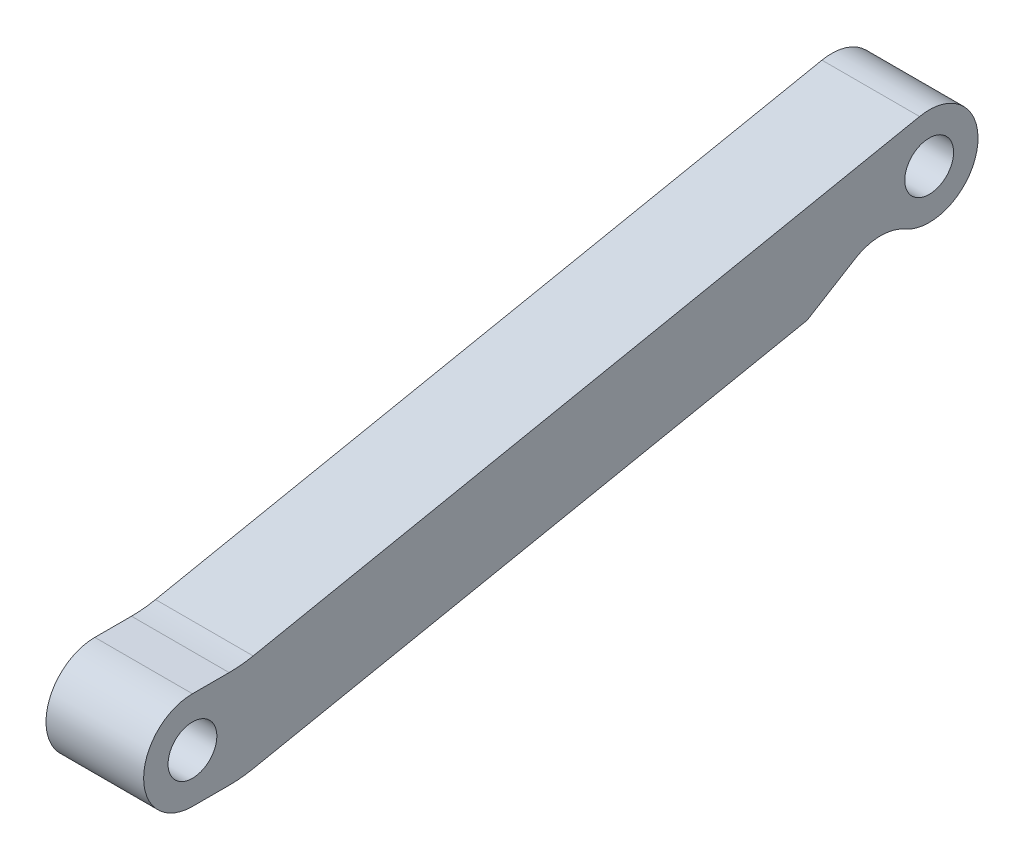
ISO-10303-21;
HEADER;
FILE_DESCRIPTION(('STEP AP214'),'2;1');
FILE_NAME('part.step','',(''),(''),'','','');
FILE_SCHEMA(('AUTOMOTIVE_DESIGN { 1 0 10303 214 1 1 1 1 }'));
ENDSEC;
DATA;
#1=APPLICATION_CONTEXT('core data for automotive mechanical design processes');
#2=APPLICATION_PROTOCOL_DEFINITION('international standard','automotive_design',2000,#1);
#3=PRODUCT_CONTEXT('',#1,'mechanical');
#4=PRODUCT('Part','Part','',(#3));
#5=PRODUCT_RELATED_PRODUCT_CATEGORY('part','',(#4));
#6=PRODUCT_DEFINITION_FORMATION('','',#4);
#7=PRODUCT_DEFINITION_CONTEXT('part definition',#1,'design');
#8=PRODUCT_DEFINITION('design','',#6,#7);
#9=PRODUCT_DEFINITION_SHAPE('','',#8);
#10=(LENGTH_UNIT() NAMED_UNIT(*) SI_UNIT(.MILLI.,.METRE.));
#11=(NAMED_UNIT(*) PLANE_ANGLE_UNIT() SI_UNIT($,.RADIAN.));
#12=(NAMED_UNIT(*) SI_UNIT($,.STERADIAN.) SOLID_ANGLE_UNIT());
#13=UNCERTAINTY_MEASURE_WITH_UNIT(LENGTH_MEASURE(1.E-05),#10,'distance_accuracy_value','');
#14=(GEOMETRIC_REPRESENTATION_CONTEXT(3) GLOBAL_UNCERTAINTY_ASSIGNED_CONTEXT((#13)) GLOBAL_UNIT_ASSIGNED_CONTEXT((#10,
#11,#12)) REPRESENTATION_CONTEXT('',''));
#15=CARTESIAN_POINT('',(0.,0.,0.));
#16=DIRECTION('',(0.,0.,1.));
#17=DIRECTION('',(1.,0.,0.));
#18=AXIS2_PLACEMENT_3D('',#15,#16,#17);
#19=CARTESIAN_POINT('',(-2.,-1.84612261210599,-75.7561745477478));
#20=DIRECTION('',(1.,0.,0.));
#21=DIRECTION('',(0.,0.,-1.));
#22=AXIS2_PLACEMENT_3D('',#19,#20,#21);
#23=CYLINDRICAL_SURFACE('',#22,2.00000000000001);
#24=DIRECTION('',(1.,0.,0.));
#25=VECTOR('',#24,1.);
#26=CARTESIAN_POINT('',(-2.,-0.110561306053009,-76.7500693877242));
#27=LINE('',#26,#25);
#28=CARTESIAN_POINT('',(-2.,-0.110561306053009,-76.7500693877242));
#29=VERTEX_POINT('',#28);
#30=CARTESIAN_POINT('',(2.,-0.110561306053009,-76.7500693877242));
#31=VERTEX_POINT('',#30);
#32=EDGE_CURVE('E43',#29,#31,#27,.T.);
#33=ORIENTED_EDGE('',*,*,#32,.T.);
#34=CARTESIAN_POINT('',(2.,-1.84612261210599,-75.7561745477478));
#35=DIRECTION('',(1.,0.,0.));
#36=DIRECTION('',(0.,0.,-1.));
#37=AXIS2_PLACEMENT_3D('',#34,#35,#36);
#38=CIRCLE('',#37,2.00000000000001);
#39=CARTESIAN_POINT('',(2.,-0.138375410523521,-74.7152136957042));
#40=VERTEX_POINT('',#39);
#41=EDGE_CURVE('E120',#31,#40,#38,.T.);
#42=ORIENTED_EDGE('',*,*,#41,.T.);
#43=DIRECTION('',(1.,0.,0.));
#44=VECTOR('',#43,1.);
#45=CARTESIAN_POINT('',(-2.,-0.138375410523521,-74.7152136957042));
#46=LINE('',#45,#44);
#47=CARTESIAN_POINT('',(-2.,-0.138375410523521,-74.7152136957042));
#48=VERTEX_POINT('',#47);
#49=EDGE_CURVE('E11',#48,#40,#46,.T.);
#50=ORIENTED_EDGE('',*,*,#49,.F.);
#51=CARTESIAN_POINT('',(-2.,-1.84612261210599,-75.7561745477478));
#52=DIRECTION('',(1.,0.,0.));
#53=DIRECTION('',(0.,0.,-1.));
#54=AXIS2_PLACEMENT_3D('',#51,#52,#53);
#55=CIRCLE('',#54,2.00000000000001);
#56=EDGE_CURVE('E56',#29,#48,#55,.T.);
#57=ORIENTED_EDGE('',*,*,#56,.F.);
#58=EDGE_LOOP('',(#33,#42,#50,#57));
#59=FACE_BOUND('',#58,.T.);
#60=ADVANCED_FACE('F39',(#59),#23,.F.);
#61=CARTESIAN_POINT('',(-2.,-33.3061606827947,-20.3018393884855));
#62=DIRECTION('',(0.,-0.853873600791226,-0.520480426021791));
#63=DIRECTION('',(0.,0.520480426021791,-0.853873600791226));
#64=AXIS2_PLACEMENT_3D('',#61,#62,#63);
#65=PLANE('',#64);
#66=ORIENTED_EDGE('',*,*,#49,.T.);
#67=DIRECTION('',(0.,0.520480426021791,-0.853873600791226));
#68=VECTOR('',#67,1.);
#69=CARTESIAN_POINT('',(2.,-33.3061606827947,-20.3018393884855));
#70=LINE('',#69,#68);
#71=CARTESIAN_POINT('',(2.,-1.33995461610038,-72.7439642277005));
#72=VERTEX_POINT('',#71);
#73=EDGE_CURVE('E137',#72,#40,#70,.T.);
#74=ORIENTED_EDGE('',*,*,#73,.F.);
#75=DIRECTION('',(1.,0.,0.));
#76=VECTOR('',#75,1.);
#77=CARTESIAN_POINT('',(-2.,-1.33995461610038,-72.7439642277005));
#78=LINE('',#77,#76);
#79=CARTESIAN_POINT('',(-2.,-1.33995461610038,-72.7439642277005));
#80=VERTEX_POINT('',#79);
#81=EDGE_CURVE('E48',#80,#72,#78,.T.);
#82=ORIENTED_EDGE('',*,*,#81,.F.);
#83=DIRECTION('',(0.,0.520480426021791,-0.853873600791226));
#84=VECTOR('',#83,1.);
#85=CARTESIAN_POINT('',(-2.,-33.3061606827947,-20.3018393884855));
#86=LINE('',#85,#84);
#87=EDGE_CURVE('E124',#80,#48,#86,.T.);
#88=ORIENTED_EDGE('',*,*,#87,.T.);
#89=EDGE_LOOP('',(#66,#74,#82,#88));
#90=FACE_BOUND('',#89,.T.);
#91=ADVANCED_FACE('F232',(#90),#65,.T.);
#92=CARTESIAN_POINT('',(-2.,-15.341055597126,-3.08340427821188));
#93=DIRECTION('',(0.,-0.980393511653588,-0.197049644271556));
#94=DIRECTION('',(0.,0.197049644271556,-0.980393511653588));
#95=AXIS2_PLACEMENT_3D('',#92,#93,#94);
#96=PLANE('',#95);
#97=ORIENTED_EDGE('',*,*,#81,.T.);
#98=DIRECTION('',(0.,0.197049644271556,-0.980393511653588));
#99=VECTOR('',#98,1.);
#100=CARTESIAN_POINT('',(2.,-15.341055597126,-3.08340427821188));
#101=LINE('',#100,#99);
#102=CARTESIAN_POINT('',(2.,-5.90196755826795,-50.0462937745782));
#103=VERTEX_POINT('',#102);
#104=EDGE_CURVE('E161',#103,#72,#101,.T.);
#105=ORIENTED_EDGE('',*,*,#104,.F.);
#106=DIRECTION('',(1.,0.,0.));
#107=VECTOR('',#106,1.);
#108=CARTESIAN_POINT('',(-2.,-5.90196755826795,-50.0462937745782));
#109=LINE('',#108,#107);
#110=CARTESIAN_POINT('',(-2.,-5.90196755826795,-50.0462937745782));
#111=VERTEX_POINT('',#110);
#112=EDGE_CURVE('E192',#111,#103,#109,.T.);
#113=ORIENTED_EDGE('',*,*,#112,.F.);
#114=DIRECTION('',(0.,0.197049644271556,-0.980393511653588));
#115=VECTOR('',#114,1.);
#116=CARTESIAN_POINT('',(-2.,-15.341055597126,-3.08340427821188));
#117=LINE('',#116,#115);
#118=EDGE_CURVE('E188',#111,#80,#117,.T.);
#119=ORIENTED_EDGE('',*,*,#118,.T.);
#120=EDGE_LOOP('',(#97,#105,#113,#119));
#121=FACE_BOUND('',#120,.T.);
#122=ADVANCED_FACE('F230',(#121),#96,.T.);
#123=CARTESIAN_POINT('',(-2.,-1.00000000000001,-49.0610455532204));
#124=DIRECTION('',(1.,0.,0.));
#125=DIRECTION('',(0.,0.,-1.));
#126=AXIS2_PLACEMENT_3D('',#123,#124,#125);
#127=CYLINDRICAL_SURFACE('',#126,5.);
#128=ORIENTED_EDGE('',*,*,#112,.T.);
#129=CARTESIAN_POINT('',(2.,-1.00000000000001,-49.0610455532204));
#130=DIRECTION('',(1.,0.,0.));
#131=DIRECTION('',(0.,0.,-1.));
#132=AXIS2_PLACEMENT_3D('',#129,#130,#131);
#133=CIRCLE('',#132,5.);
#134=CARTESIAN_POINT('',(2.,-6.00000000000001,-49.0610455532204));
#135=VERTEX_POINT('',#134);
#136=EDGE_CURVE('E158',#135,#103,#133,.T.);
#137=ORIENTED_EDGE('',*,*,#136,.F.);
#138=DIRECTION('',(1.,0.,0.));
#139=VECTOR('',#138,1.);
#140=CARTESIAN_POINT('',(-2.,-6.00000000000001,-49.0610455532204));
#141=LINE('',#140,#139);
#142=CARTESIAN_POINT('',(-2.,-6.00000000000001,-49.0610455532204));
#143=VERTEX_POINT('',#142);
#144=EDGE_CURVE('E194',#143,#135,#141,.T.);
#145=ORIENTED_EDGE('',*,*,#144,.F.);
#146=CARTESIAN_POINT('',(-2.,-1.00000000000001,-49.0610455532204));
#147=DIRECTION('',(1.,0.,0.));
#148=DIRECTION('',(0.,0.,-1.));
#149=AXIS2_PLACEMENT_3D('',#146,#147,#148);
#150=CIRCLE('',#149,5.);
#151=EDGE_CURVE('E185',#143,#111,#150,.T.);
#152=ORIENTED_EDGE('',*,*,#151,.T.);
#153=EDGE_LOOP('',(#128,#137,#145,#152));
#154=FACE_BOUND('',#153,.T.);
#155=ADVANCED_FACE('F227',(#154),#127,.T.);
#156=CARTESIAN_POINT('',(-2.,-6.00000000000006,0.));
#157=DIRECTION('',(0.,-1.,0.));
#158=DIRECTION('',(0.,0.,-1.));
#159=AXIS2_PLACEMENT_3D('',#156,#157,#158);
#160=PLANE('',#159);
#161=ORIENTED_EDGE('',*,*,#144,.T.);
#162=DIRECTION('',(0.,0.,-1.));
#163=VECTOR('',#162,1.);
#164=CARTESIAN_POINT('',(2.,-6.00000000000006,0.));
#165=LINE('',#164,#163);
#166=CARTESIAN_POINT('',(2.,-6.00000000000001,-47.55854679));
#167=VERTEX_POINT('',#166);
#168=EDGE_CURVE('E155',#167,#135,#165,.T.);
#169=ORIENTED_EDGE('',*,*,#168,.F.);
#170=DIRECTION('',(1.,0.,0.));
#171=VECTOR('',#170,1.);
#172=CARTESIAN_POINT('',(-2.,-6.00000000000001,-47.55854679));
#173=LINE('',#172,#171);
#174=CARTESIAN_POINT('',(-2.,-6.00000000000001,-47.55854679));
#175=VERTEX_POINT('',#174);
#176=EDGE_CURVE('E196',#175,#167,#173,.T.);
#177=ORIENTED_EDGE('',*,*,#176,.F.);
#178=DIRECTION('',(0.,0.,-1.));
#179=VECTOR('',#178,1.);
#180=CARTESIAN_POINT('',(-2.,-6.00000000000006,0.));
#181=LINE('',#180,#179);
#182=EDGE_CURVE('E182',#175,#143,#181,.T.);
#183=ORIENTED_EDGE('',*,*,#182,.T.);
#184=EDGE_LOOP('',(#161,#169,#177,#183));
#185=FACE_BOUND('',#184,.T.);
#186=ADVANCED_FACE('F223',(#185),#160,.T.);
#187=CARTESIAN_POINT('',(-2.,-4.00000000000001,-47.55854679));
#188=DIRECTION('',(1.,0.,0.));
#189=DIRECTION('',(0.,0.,-1.));
#190=AXIS2_PLACEMENT_3D('',#187,#188,#189);
#191=CYLINDRICAL_SURFACE('',#190,2.);
#192=ORIENTED_EDGE('',*,*,#176,.T.);
#193=CARTESIAN_POINT('',(2.,-4.00000000000001,-47.55854679));
#194=DIRECTION('',(1.,0.,0.));
#195=DIRECTION('',(0.,0.,-1.));
#196=AXIS2_PLACEMENT_3D('',#193,#194,#195);
#197=CIRCLE('',#196,2.);
#198=CARTESIAN_POINT('',(2.,-2.00000000000001,-47.55854679));
#199=VERTEX_POINT('',#198);
#200=EDGE_CURVE('E152',#199,#167,#197,.T.);
#201=ORIENTED_EDGE('',*,*,#200,.F.);
#202=DIRECTION('',(1.,0.,0.));
#203=VECTOR('',#202,1.);
#204=CARTESIAN_POINT('',(-2.,-2.00000000000001,-47.55854679));
#205=LINE('',#204,#203);
#206=CARTESIAN_POINT('',(-2.,-2.00000000000001,-47.55854679));
#207=VERTEX_POINT('',#206);
#208=EDGE_CURVE('E198',#207,#199,#205,.T.);
#209=ORIENTED_EDGE('',*,*,#208,.F.);
#210=CARTESIAN_POINT('',(-2.,-4.00000000000001,-47.55854679));
#211=DIRECTION('',(1.,0.,0.));
#212=DIRECTION('',(0.,0.,-1.));
#213=AXIS2_PLACEMENT_3D('',#210,#211,#212);
#214=CIRCLE('',#213,2.);
#215=EDGE_CURVE('E179',#207,#175,#214,.T.);
#216=ORIENTED_EDGE('',*,*,#215,.T.);
#217=EDGE_LOOP('',(#192,#201,#209,#216));
#218=FACE_BOUND('',#217,.T.);
#219=ADVANCED_FACE('F220',(#218),#191,.T.);
#220=CARTESIAN_POINT('',(-2.,-2.00000000000001,0.));
#221=DIRECTION('',(0.,-1.,0.));
#222=DIRECTION('',(0.,0.,-1.));
#223=AXIS2_PLACEMENT_3D('',#220,#221,#222);
#224=PLANE('',#223);
#225=ORIENTED_EDGE('',*,*,#208,.T.);
#226=DIRECTION('',(0.,0.,-1.));
#227=VECTOR('',#226,1.);
#228=CARTESIAN_POINT('',(2.,-2.00000000000001,0.));
#229=LINE('',#228,#227);
#230=CARTESIAN_POINT('',(2.,-2.00000000000001,-49.0610455532204));
#231=VERTEX_POINT('',#230);
#232=EDGE_CURVE('E149',#199,#231,#229,.T.);
#233=ORIENTED_EDGE('',*,*,#232,.T.);
#234=DIRECTION('',(1.,0.,0.));
#235=VECTOR('',#234,1.);
#236=CARTESIAN_POINT('',(-2.,-2.00000000000001,-49.0610455532204));
#237=LINE('',#236,#235);
#238=CARTESIAN_POINT('',(-2.,-2.00000000000001,-49.0610455532204));
#239=VERTEX_POINT('',#238);
#240=EDGE_CURVE('E200',#239,#231,#237,.T.);
#241=ORIENTED_EDGE('',*,*,#240,.F.);
#242=DIRECTION('',(0.,0.,-1.));
#243=VECTOR('',#242,1.);
#244=CARTESIAN_POINT('',(-2.,-2.00000000000001,0.));
#245=LINE('',#244,#243);
#246=EDGE_CURVE('E177',#207,#239,#245,.T.);
#247=ORIENTED_EDGE('',*,*,#246,.F.);
#248=EDGE_LOOP('',(#225,#233,#241,#247));
#249=FACE_BOUND('',#248,.T.);
#250=ADVANCED_FACE('F215',(#249),#224,.F.);
#251=CARTESIAN_POINT('',(-2.,2.99999999999999,-49.0610455532204));
#252=DIRECTION('',(1.,0.,0.));
#253=DIRECTION('',(0.,0.,-1.));
#254=AXIS2_PLACEMENT_3D('',#251,#252,#253);
#255=CYLINDRICAL_SURFACE('',#254,5.);
#256=ORIENTED_EDGE('',*,*,#240,.T.);
#257=CARTESIAN_POINT('',(2.,2.99999999999999,-49.0610455532204));
#258=DIRECTION('',(1.,0.,0.));
#259=DIRECTION('',(0.,0.,-1.));
#260=AXIS2_PLACEMENT_3D('',#257,#258,#259);
#261=CIRCLE('',#260,5.);
#262=CARTESIAN_POINT('',(2.,-1.90196755826794,-50.0462937745782));
#263=VERTEX_POINT('',#262);
#264=EDGE_CURVE('E146',#231,#263,#261,.T.);
#265=ORIENTED_EDGE('',*,*,#264,.T.);
#266=DIRECTION('',(1.,0.,0.));
#267=VECTOR('',#266,1.);
#268=CARTESIAN_POINT('',(-2.,-1.90196755826794,-50.0462937745782));
#269=LINE('',#268,#267);
#270=CARTESIAN_POINT('',(-2.,-1.90196755826794,-50.0462937745782));
#271=VERTEX_POINT('',#270);
#272=EDGE_CURVE('E202',#271,#263,#269,.T.);
#273=ORIENTED_EDGE('',*,*,#272,.F.);
#274=CARTESIAN_POINT('',(-2.,2.99999999999999,-49.0610455532204));
#275=DIRECTION('',(1.,0.,0.));
#276=DIRECTION('',(0.,0.,-1.));
#277=AXIS2_PLACEMENT_3D('',#274,#275,#276);
#278=CIRCLE('',#277,5.);
#279=EDGE_CURVE('E175',#239,#271,#278,.T.);
#280=ORIENTED_EDGE('',*,*,#279,.F.);
#281=EDGE_LOOP('',(#256,#265,#273,#280));
#282=FACE_BOUND('',#281,.T.);
#283=ADVANCED_FACE('F211',(#282),#255,.F.);
#284=CARTESIAN_POINT('',(-2.,-11.4963698463562,-2.31065950734196));
#285=DIRECTION('',(0.,-0.980393511653588,-0.197049644271556));
#286=DIRECTION('',(0.,0.197049644271556,-0.980393511653588));
#287=AXIS2_PLACEMENT_3D('',#284,#285,#286);
#288=PLANE('',#287);
#289=ORIENTED_EDGE('',*,*,#272,.T.);
#290=DIRECTION('',(0.,0.197049644271556,-0.980393511653588));
#291=VECTOR('',#290,1.);
#292=CARTESIAN_POINT('',(2.,-11.4963698463562,-2.31065950734196));
#293=LINE('',#292,#291);
#294=CARTESIAN_POINT('',(2.,3.58578702330714,-77.3498649391574));
#295=VERTEX_POINT('',#294);
#296=EDGE_CURVE('E132',#263,#295,#293,.T.);
#297=ORIENTED_EDGE('',*,*,#296,.T.);
#298=DIRECTION('',(1.,0.,0.));
#299=VECTOR('',#298,1.);
#300=CARTESIAN_POINT('',(-2.,3.58578702330714,-77.3498649391574));
#301=LINE('',#300,#299);
#302=CARTESIAN_POINT('',(-2.,3.58578702330714,-77.3498649391574));
#303=VERTEX_POINT('',#302);
#304=EDGE_CURVE('E123',#303,#295,#301,.T.);
#305=ORIENTED_EDGE('',*,*,#304,.F.);
#306=DIRECTION('',(0.,0.197049644271556,-0.980393511653588));
#307=VECTOR('',#306,1.);
#308=CARTESIAN_POINT('',(-2.,-11.4963698463562,-2.31065950734196));
#309=LINE('',#308,#307);
#310=EDGE_CURVE('E173',#271,#303,#309,.T.);
#311=ORIENTED_EDGE('',*,*,#310,.F.);
#312=EDGE_LOOP('',(#289,#297,#305,#311));
#313=FACE_BOUND('',#312,.T.);
#314=ADVANCED_FACE('F206',(#313),#288,.F.);
#315=CARTESIAN_POINT('',(-2.,1.62499999999996,-77.7439642277005));
#316=DIRECTION('',(1.,0.,0.));
#317=DIRECTION('',(0.,0.,-1.));
#318=AXIS2_PLACEMENT_3D('',#315,#316,#317);
#319=CYLINDRICAL_SURFACE('',#318,1.00000000000001);
#320=CARTESIAN_POINT('',(-2.,1.62499999999996,-77.7439642277005));
#321=DIRECTION('',(1.,0.,0.));
#322=DIRECTION('',(0.,0.,-1.));
#323=AXIS2_PLACEMENT_3D('',#320,#321,#322);
#324=CIRCLE('',#323,1.00000000000001);
#325=CARTESIAN_POINT('',(-2.,1.62499999999996,-78.7439642277006));
#326=VERTEX_POINT('',#325);
#327=EDGE_CURVE('E167',#326,#326,#324,.T.);
#328=ORIENTED_EDGE('',*,*,#327,.F.);
#329=EDGE_LOOP('',(#328));
#330=FACE_BOUND('',#329,.T.);
#331=CARTESIAN_POINT('',(2.,1.62499999999996,-77.7439642277005));
#332=DIRECTION('',(1.,0.,0.));
#333=DIRECTION('',(0.,0.,-1.));
#334=AXIS2_PLACEMENT_3D('',#331,#332,#333);
#335=CIRCLE('',#334,1.00000000000001);
#336=CARTESIAN_POINT('',(2.,1.62499999999996,-78.7439642277006));
#337=VERTEX_POINT('',#336);
#338=EDGE_CURVE('E138',#337,#337,#335,.T.);
#339=ORIENTED_EDGE('',*,*,#338,.T.);
#340=EDGE_LOOP('',(#339));
#341=FACE_BOUND('',#340,.T.);
#342=ADVANCED_FACE('F252',(#330,#341),#319,.F.);
#343=CARTESIAN_POINT('',(-2.,-4.00000000000001,-47.55854679));
#344=DIRECTION('',(1.,0.,0.));
#345=DIRECTION('',(0.,0.,-1.));
#346=AXIS2_PLACEMENT_3D('',#343,#344,#345);
#347=CYLINDRICAL_SURFACE('',#346,1.00000000000001);
#348=CARTESIAN_POINT('',(-2.,-4.00000000000001,-47.55854679));
#349=DIRECTION('',(1.,0.,0.));
#350=DIRECTION('',(0.,0.,-1.));
#351=AXIS2_PLACEMENT_3D('',#348,#349,#350);
#352=CIRCLE('',#351,1.00000000000001);
#353=CARTESIAN_POINT('',(-2.,-4.00000000000001,-48.55854679));
#354=VERTEX_POINT('',#353);
#355=EDGE_CURVE('E164',#354,#354,#352,.T.);
#356=ORIENTED_EDGE('',*,*,#355,.F.);
#357=EDGE_LOOP('',(#356));
#358=FACE_BOUND('',#357,.T.);
#359=CARTESIAN_POINT('',(2.,-4.00000000000001,-47.55854679));
#360=DIRECTION('',(1.,0.,0.));
#361=DIRECTION('',(0.,0.,-1.));
#362=AXIS2_PLACEMENT_3D('',#359,#360,#361);
#363=CIRCLE('',#362,1.00000000000001);
#364=CARTESIAN_POINT('',(2.,-4.00000000000001,-48.55854679));
#365=VERTEX_POINT('',#364);
#366=EDGE_CURVE('E141',#365,#365,#363,.T.);
#367=ORIENTED_EDGE('',*,*,#366,.T.);
#368=EDGE_LOOP('',(#367));
#369=FACE_BOUND('',#368,.T.);
#370=ADVANCED_FACE('F41',(#358,#369),#347,.F.);
#371=CARTESIAN_POINT('',(-2.,1.62499999999996,-77.7439642277005));
#372=DIRECTION('',(1.,0.,0.));
#373=DIRECTION('',(0.,0.,-1.));
#374=AXIS2_PLACEMENT_3D('',#371,#372,#373);
#375=CYLINDRICAL_SURFACE('',#374,2.);
#376=ORIENTED_EDGE('',*,*,#304,.T.);
#377=CARTESIAN_POINT('',(2.,1.62499999999996,-77.7439642277005));
#378=DIRECTION('',(1.,0.,0.));
#379=DIRECTION('',(0.,0.,-1.));
#380=AXIS2_PLACEMENT_3D('',#377,#378,#379);
#381=CIRCLE('',#380,2.);
#382=EDGE_CURVE('E126',#31,#295,#381,.T.);
#383=ORIENTED_EDGE('',*,*,#382,.F.);
#384=ORIENTED_EDGE('',*,*,#32,.F.);
#385=CARTESIAN_POINT('',(-2.,1.62499999999996,-77.7439642277005));
#386=DIRECTION('',(1.,0.,0.));
#387=DIRECTION('',(0.,0.,-1.));
#388=AXIS2_PLACEMENT_3D('',#385,#386,#387);
#389=CIRCLE('',#388,2.);
#390=EDGE_CURVE('E171',#29,#303,#389,.T.);
#391=ORIENTED_EDGE('',*,*,#390,.T.);
#392=EDGE_LOOP('',(#376,#383,#384,#391));
#393=FACE_BOUND('',#392,.T.);
#394=ADVANCED_FACE('F127',(#393),#375,.T.);
#395=CARTESIAN_POINT('',(-2.,0.,0.));
#396=DIRECTION('',(1.,0.,0.));
#397=DIRECTION('',(0.,0.,-1.));
#398=AXIS2_PLACEMENT_3D('',#395,#396,#397);
#399=PLANE('',#398);
#400=ORIENTED_EDGE('',*,*,#355,.T.);
#401=EDGE_LOOP('',(#400));
#402=FACE_BOUND('',#401,.T.);
#403=ORIENTED_EDGE('',*,*,#327,.T.);
#404=EDGE_LOOP('',(#403));
#405=FACE_BOUND('',#404,.T.);
#406=ORIENTED_EDGE('',*,*,#56,.T.);
#407=ORIENTED_EDGE('',*,*,#87,.F.);
#408=ORIENTED_EDGE('',*,*,#118,.F.);
#409=ORIENTED_EDGE('',*,*,#151,.F.);
#410=ORIENTED_EDGE('',*,*,#182,.F.);
#411=ORIENTED_EDGE('',*,*,#215,.F.);
#412=ORIENTED_EDGE('',*,*,#246,.T.);
#413=ORIENTED_EDGE('',*,*,#279,.T.);
#414=ORIENTED_EDGE('',*,*,#310,.T.);
#415=ORIENTED_EDGE('',*,*,#390,.F.);
#416=EDGE_LOOP('',(#406,#407,#408,#409,#410,#411,#412,#413,#414,#415));
#417=FACE_BOUND('',#416,.T.);
#418=ADVANCED_FACE('F233',(#402,#405,#417),#399,.F.);
#419=CARTESIAN_POINT('',(2.,0.,0.));
#420=DIRECTION('',(1.,0.,0.));
#421=DIRECTION('',(0.,0.,-1.));
#422=AXIS2_PLACEMENT_3D('',#419,#420,#421);
#423=PLANE('',#422);
#424=ORIENTED_EDGE('',*,*,#366,.F.);
#425=EDGE_LOOP('',(#424));
#426=FACE_BOUND('',#425,.T.);
#427=ORIENTED_EDGE('',*,*,#338,.F.);
#428=EDGE_LOOP('',(#427));
#429=FACE_BOUND('',#428,.T.);
#430=ORIENTED_EDGE('',*,*,#41,.F.);
#431=ORIENTED_EDGE('',*,*,#382,.T.);
#432=ORIENTED_EDGE('',*,*,#296,.F.);
#433=ORIENTED_EDGE('',*,*,#264,.F.);
#434=ORIENTED_EDGE('',*,*,#232,.F.);
#435=ORIENTED_EDGE('',*,*,#200,.T.);
#436=ORIENTED_EDGE('',*,*,#168,.T.);
#437=ORIENTED_EDGE('',*,*,#136,.T.);
#438=ORIENTED_EDGE('',*,*,#104,.T.);
#439=ORIENTED_EDGE('',*,*,#73,.T.);
#440=EDGE_LOOP('',(#430,#431,#432,#433,#434,#435,#436,#437,#438,#439));
#441=FACE_BOUND('',#440,.T.);
#442=ADVANCED_FACE('F135',(#426,#429,#441),#423,.T.);
#443=CLOSED_SHELL('',(#60,#91,#122,#155,#186,#219,#250,#283,#314,#342,#370,#394,#418,#442));
#444=MANIFOLD_SOLID_BREP('B2',#443);
#445=ADVANCED_BREP_SHAPE_REPRESENTATION('',(#18,#444),#14);
#446=SHAPE_DEFINITION_REPRESENTATION(#9,#445);
ENDSEC;
END-ISO-10303-21;
